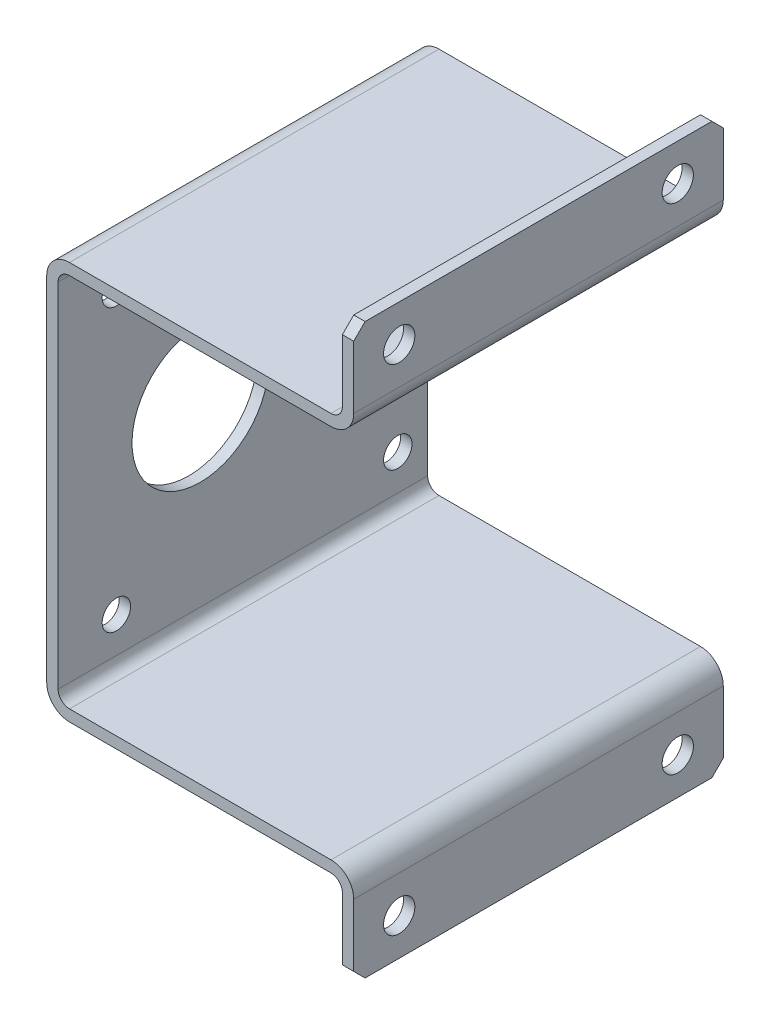
ISO-10303-21;
HEADER;
FILE_DESCRIPTION(('STEP AP214'),'2;1');
FILE_NAME('part.step','',(''),(''),'','','');
FILE_SCHEMA(('AUTOMOTIVE_DESIGN { 1 0 10303 214 1 1 1 1 }'));
ENDSEC;
DATA;
#1=APPLICATION_CONTEXT('core data for automotive mechanical design processes');
#2=APPLICATION_PROTOCOL_DEFINITION('international standard','automotive_design',2000,#1);
#3=PRODUCT_CONTEXT('',#1,'mechanical');
#4=PRODUCT('Part','Part','',(#3));
#5=PRODUCT_RELATED_PRODUCT_CATEGORY('part','',(#4));
#6=PRODUCT_DEFINITION_FORMATION('','',#4);
#7=PRODUCT_DEFINITION_CONTEXT('part definition',#1,'design');
#8=PRODUCT_DEFINITION('design','',#6,#7);
#9=PRODUCT_DEFINITION_SHAPE('','',#8);
#10=(LENGTH_UNIT() NAMED_UNIT(*) SI_UNIT(.MILLI.,.METRE.));
#11=(NAMED_UNIT(*) PLANE_ANGLE_UNIT() SI_UNIT($,.RADIAN.));
#12=(NAMED_UNIT(*) SI_UNIT($,.STERADIAN.) SOLID_ANGLE_UNIT());
#13=UNCERTAINTY_MEASURE_WITH_UNIT(LENGTH_MEASURE(1.E-05),#10,'distance_accuracy_value','');
#14=(GEOMETRIC_REPRESENTATION_CONTEXT(3) GLOBAL_UNCERTAINTY_ASSIGNED_CONTEXT((#13)) GLOBAL_UNIT_ASSIGNED_CONTEXT((#10,
#11,#12)) REPRESENTATION_CONTEXT('',''));
#15=CARTESIAN_POINT('',(0.,0.,0.));
#16=DIRECTION('',(0.,0.,1.));
#17=DIRECTION('',(1.,0.,0.));
#18=AXIS2_PLACEMENT_3D('',#15,#16,#17);
#19=CARTESIAN_POINT('',(0.,-50.,65.));
#20=DIRECTION('',(0.,1.,0.));
#21=DIRECTION('',(0.,0.,1.));
#22=AXIS2_PLACEMENT_3D('',#19,#20,#21);
#23=PLANE('',#22);
#24=DIRECTION('',(0.,0.,-1.));
#25=VECTOR('',#24,1.);
#26=CARTESIAN_POINT('',(-2.,-50.,65.));
#27=LINE('',#26,#25);
#28=CARTESIAN_POINT('',(-2.,-50.,63.));
#29=VERTEX_POINT('',#28);
#30=CARTESIAN_POINT('',(-2.,-50.,2.00000000000001));
#31=VERTEX_POINT('',#30);
#32=EDGE_CURVE('E214',#29,#31,#27,.T.);
#33=ORIENTED_EDGE('',*,*,#32,.T.);
#34=DIRECTION('',(1.,0.,0.));
#35=VECTOR('',#34,1.);
#36=CARTESIAN_POINT('',(0.,-50.,2.));
#37=LINE('',#36,#35);
#38=CARTESIAN_POINT('',(0.,-50.,2.00000000000001));
#39=VERTEX_POINT('',#38);
#40=EDGE_CURVE('E244',#31,#39,#37,.T.);
#41=ORIENTED_EDGE('',*,*,#40,.T.);
#42=DIRECTION('',(0.,0.,-1.));
#43=VECTOR('',#42,1.);
#44=CARTESIAN_POINT('',(0.,-50.,65.));
#45=LINE('',#44,#43);
#46=CARTESIAN_POINT('',(0.,-50.,63.));
#47=VERTEX_POINT('',#46);
#48=EDGE_CURVE('E220',#47,#39,#45,.T.);
#49=ORIENTED_EDGE('',*,*,#48,.F.);
#50=DIRECTION('',(-1.,0.,0.));
#51=VECTOR('',#50,1.);
#52=CARTESIAN_POINT('',(0.,-50.,63.));
#53=LINE('',#52,#51);
#54=EDGE_CURVE('E242',#47,#29,#53,.T.);
#55=ORIENTED_EDGE('',*,*,#54,.T.);
#56=EDGE_LOOP('',(#33,#41,#49,#55));
#57=FACE_BOUND('',#56,.T.);
#58=ADVANCED_FACE('F32',(#57),#23,.F.);
#59=CARTESIAN_POINT('',(0.,-33.,65.));
#60=DIRECTION('',(-1.,0.,0.));
#61=DIRECTION('',(0.,-1.,0.));
#62=AXIS2_PLACEMENT_3D('',#59,#60,#61);
#63=PLANE('',#62);
#64=CARTESIAN_POINT('',(0.,-43.5,57.));
#65=DIRECTION('',(-1.,0.,0.));
#66=DIRECTION('',(0.,0.,1.));
#67=AXIS2_PLACEMENT_3D('',#64,#65,#66);
#68=CIRCLE('',#67,2.75);
#69=CARTESIAN_POINT('',(0.,-43.5,59.75));
#70=VERTEX_POINT('',#69);
#71=EDGE_CURVE('E505',#70,#70,#68,.T.);
#72=ORIENTED_EDGE('',*,*,#71,.T.);
#73=EDGE_LOOP('',(#72));
#74=FACE_BOUND('',#73,.T.);
#75=CARTESIAN_POINT('',(0.,-43.5,8.));
#76=DIRECTION('',(-1.,0.,0.));
#77=DIRECTION('',(0.,0.,1.));
#78=AXIS2_PLACEMENT_3D('',#75,#76,#77);
#79=CIRCLE('',#78,2.75);
#80=CARTESIAN_POINT('',(0.,-43.5,10.75));
#81=VERTEX_POINT('',#80);
#82=EDGE_CURVE('E499',#81,#81,#79,.T.);
#83=ORIENTED_EDGE('',*,*,#82,.T.);
#84=EDGE_LOOP('',(#83));
#85=FACE_BOUND('',#84,.T.);
#86=DIRECTION('',(0.,1.,0.));
#87=VECTOR('',#86,1.);
#88=CARTESIAN_POINT('',(0.,-33.,0.));
#89=LINE('',#88,#87);
#90=CARTESIAN_POINT('',(0.,-48.,0.));
#91=VERTEX_POINT('',#90);
#92=CARTESIAN_POINT('',(0.,-37.,0.));
#93=VERTEX_POINT('',#92);
#94=EDGE_CURVE('E364',#91,#93,#89,.T.);
#95=ORIENTED_EDGE('',*,*,#94,.T.);
#96=DIRECTION('',(0.,0.,-1.));
#97=VECTOR('',#96,1.);
#98=CARTESIAN_POINT('',(0.,-37.,65.));
#99=LINE('',#98,#97);
#100=CARTESIAN_POINT('',(0.,-37.,65.));
#101=VERTEX_POINT('',#100);
#102=EDGE_CURVE('E294',#93,#101,#99,.F.);
#103=ORIENTED_EDGE('',*,*,#102,.T.);
#104=DIRECTION('',(0.,1.,0.));
#105=VECTOR('',#104,1.);
#106=CARTESIAN_POINT('',(0.,-33.,65.));
#107=LINE('',#106,#105);
#108=CARTESIAN_POINT('',(0.,-48.,65.));
#109=VERTEX_POINT('',#108);
#110=EDGE_CURVE('E385',#109,#101,#107,.T.);
#111=ORIENTED_EDGE('',*,*,#110,.F.);
#112=DIRECTION('',(0.,0.707106781186545,0.70710678118655));
#113=VECTOR('',#112,1.);
#114=CARTESIAN_POINT('',(0.,-48.,65.));
#115=LINE('',#114,#113);
#116=EDGE_CURVE('E247',#109,#47,#115,.F.);
#117=ORIENTED_EDGE('',*,*,#116,.T.);
#118=ORIENTED_EDGE('',*,*,#48,.T.);
#119=DIRECTION('',(0.,0.70710678118655,-0.707106781186545));
#120=VECTOR('',#119,1.);
#121=CARTESIAN_POINT('',(0.,-50.,2.));
#122=LINE('',#121,#120);
#123=EDGE_CURVE('E249',#39,#91,#122,.T.);
#124=ORIENTED_EDGE('',*,*,#123,.T.);
#125=EDGE_LOOP('',(#95,#103,#111,#117,#118,#124));
#126=FACE_BOUND('',#125,.T.);
#127=ADVANCED_FACE('F422',(#74,#85,#126),#63,.F.);
#128=CARTESIAN_POINT('',(-52.,-33.,65.));
#129=DIRECTION('',(0.,-1.,0.));
#130=DIRECTION('',(0.,0.,-1.));
#131=AXIS2_PLACEMENT_3D('',#128,#129,#130);
#132=PLANE('',#131);
#133=DIRECTION('',(-1.,0.,0.));
#134=VECTOR('',#133,1.);
#135=CARTESIAN_POINT('',(-52.,-33.,0.));
#136=LINE('',#135,#134);
#137=CARTESIAN_POINT('',(-4.,-33.,0.));
#138=VERTEX_POINT('',#137);
#139=CARTESIAN_POINT('',(-50.,-33.,0.));
#140=VERTEX_POINT('',#139);
#141=EDGE_CURVE('E338',#138,#140,#136,.T.);
#142=ORIENTED_EDGE('',*,*,#141,.T.);
#143=DIRECTION('',(0.,0.,-1.));
#144=VECTOR('',#143,1.);
#145=CARTESIAN_POINT('',(-50.,-33.,65.));
#146=LINE('',#145,#144);
#147=CARTESIAN_POINT('',(-50.,-33.,65.));
#148=VERTEX_POINT('',#147);
#149=EDGE_CURVE('E311',#140,#148,#146,.F.);
#150=ORIENTED_EDGE('',*,*,#149,.T.);
#151=DIRECTION('',(-1.,0.,0.));
#152=VECTOR('',#151,1.);
#153=CARTESIAN_POINT('',(-52.,-33.,65.));
#154=LINE('',#153,#152);
#155=CARTESIAN_POINT('',(-4.,-33.,65.));
#156=VERTEX_POINT('',#155);
#157=EDGE_CURVE('E349',#156,#148,#154,.T.);
#158=ORIENTED_EDGE('',*,*,#157,.F.);
#159=DIRECTION('',(0.,0.,-1.));
#160=VECTOR('',#159,1.);
#161=CARTESIAN_POINT('',(-4.,-33.,65.));
#162=LINE('',#161,#160);
#163=EDGE_CURVE('E291',#156,#138,#162,.T.);
#164=ORIENTED_EDGE('',*,*,#163,.T.);
#165=EDGE_LOOP('',(#142,#150,#158,#164));
#166=FACE_BOUND('',#165,.T.);
#167=ADVANCED_FACE('F428',(#166),#132,.F.);
#168=CARTESIAN_POINT('',(-52.,33.,65.));
#169=DIRECTION('',(-1.,0.,0.));
#170=DIRECTION('',(0.,-1.,0.));
#171=AXIS2_PLACEMENT_3D('',#168,#169,#170);
#172=PLANE('',#171);
#173=CARTESIAN_POINT('',(-52.,24.7487373415291,54.7487373415292));
#174=DIRECTION('',(-1.,0.,0.));
#175=DIRECTION('',(0.,-1.,0.));
#176=AXIS2_PLACEMENT_3D('',#173,#174,#175);
#177=CIRCLE('',#176,2.49999999999999);
#178=CARTESIAN_POINT('',(-52.,22.2487373415291,54.7487373415292));
#179=VERTEX_POINT('',#178);
#180=EDGE_CURVE('E529',#179,#179,#177,.T.);
#181=ORIENTED_EDGE('',*,*,#180,.T.);
#182=EDGE_LOOP('',(#181));
#183=FACE_BOUND('',#182,.T.);
#184=CARTESIAN_POINT('',(-52.,-24.7487373415291,54.7487373415292));
#185=DIRECTION('',(-1.,0.,0.));
#186=DIRECTION('',(0.,-1.,0.));
#187=AXIS2_PLACEMENT_3D('',#184,#185,#186);
#188=CIRCLE('',#187,2.49999999999999);
#189=CARTESIAN_POINT('',(-52.,-27.2487373415291,54.7487373415292));
#190=VERTEX_POINT('',#189);
#191=EDGE_CURVE('E523',#190,#190,#188,.T.);
#192=ORIENTED_EDGE('',*,*,#191,.T.);
#193=EDGE_LOOP('',(#192));
#194=FACE_BOUND('',#193,.T.);
#195=CARTESIAN_POINT('',(-52.,-24.7487373415291,5.25126265847079));
#196=DIRECTION('',(-1.,0.,0.));
#197=DIRECTION('',(0.,-1.,0.));
#198=AXIS2_PLACEMENT_3D('',#195,#196,#197);
#199=CIRCLE('',#198,2.49999999999999);
#200=CARTESIAN_POINT('',(-52.,-27.2487373415291,5.25126265847079));
#201=VERTEX_POINT('',#200);
#202=EDGE_CURVE('E517',#201,#201,#199,.T.);
#203=ORIENTED_EDGE('',*,*,#202,.T.);
#204=EDGE_LOOP('',(#203));
#205=FACE_BOUND('',#204,.T.);
#206=CARTESIAN_POINT('',(-52.,24.7487373415291,5.25126265847079));
#207=DIRECTION('',(-1.,0.,0.));
#208=DIRECTION('',(0.,-1.,0.));
#209=AXIS2_PLACEMENT_3D('',#206,#207,#208);
#210=CIRCLE('',#209,2.49999999999999);
#211=CARTESIAN_POINT('',(-52.,22.2487373415291,5.25126265847079));
#212=VERTEX_POINT('',#211);
#213=EDGE_CURVE('E511',#212,#212,#210,.T.);
#214=ORIENTED_EDGE('',*,*,#213,.T.);
#215=EDGE_LOOP('',(#214));
#216=FACE_BOUND('',#215,.T.);
#217=CARTESIAN_POINT('',(-52.,0.,40.));
#218=DIRECTION('',(-1.,0.,0.));
#219=DIRECTION('',(0.,-1.,0.));
#220=AXIS2_PLACEMENT_3D('',#217,#218,#219);
#221=CIRCLE('',#220,12.);
#222=CARTESIAN_POINT('',(-52.,-12.,40.));
#223=VERTEX_POINT('',#222);
#224=EDGE_CURVE('E367',#223,#223,#221,.T.);
#225=ORIENTED_EDGE('',*,*,#224,.T.);
#226=EDGE_LOOP('',(#225));
#227=FACE_BOUND('',#226,.T.);
#228=DIRECTION('',(0.,1.,0.));
#229=VECTOR('',#228,1.);
#230=CARTESIAN_POINT('',(-52.,33.,65.));
#231=LINE('',#230,#229);
#232=CARTESIAN_POINT('',(-52.,-31.,65.));
#233=VERTEX_POINT('',#232);
#234=CARTESIAN_POINT('',(-52.,31.,65.));
#235=VERTEX_POINT('',#234);
#236=EDGE_CURVE('E346',#233,#235,#231,.T.);
#237=ORIENTED_EDGE('',*,*,#236,.F.);
#238=DIRECTION('',(0.,0.,-1.));
#239=VECTOR('',#238,1.);
#240=CARTESIAN_POINT('',(-52.,-31.,0.));
#241=LINE('',#240,#239);
#242=CARTESIAN_POINT('',(-52.,-31.,0.));
#243=VERTEX_POINT('',#242);
#244=EDGE_CURVE('E308',#233,#243,#241,.T.);
#245=ORIENTED_EDGE('',*,*,#244,.T.);
#246=DIRECTION('',(0.,1.,0.));
#247=VECTOR('',#246,1.);
#248=CARTESIAN_POINT('',(-52.,33.,0.));
#249=LINE('',#248,#247);
#250=CARTESIAN_POINT('',(-52.,31.,0.));
#251=VERTEX_POINT('',#250);
#252=EDGE_CURVE('E332',#243,#251,#249,.T.);
#253=ORIENTED_EDGE('',*,*,#252,.T.);
#254=DIRECTION('',(0.,0.,-1.));
#255=VECTOR('',#254,1.);
#256=CARTESIAN_POINT('',(-52.,31.,65.));
#257=LINE('',#256,#255);
#258=EDGE_CURVE('E306',#251,#235,#257,.F.);
#259=ORIENTED_EDGE('',*,*,#258,.T.);
#260=EDGE_LOOP('',(#237,#245,#253,#259));
#261=FACE_BOUND('',#260,.T.);
#262=ADVANCED_FACE('F336',(#183,#194,#205,#216,#227,#261),#172,.F.);
#263=CARTESIAN_POINT('',(0.,33.,65.));
#264=DIRECTION('',(0.,1.,0.));
#265=DIRECTION('',(-1.,0.,0.));
#266=AXIS2_PLACEMENT_3D('',#263,#264,#265);
#267=PLANE('',#266);
#268=DIRECTION('',(1.,0.,0.));
#269=VECTOR('',#268,1.);
#270=CARTESIAN_POINT('',(0.,33.,65.));
#271=LINE('',#270,#269);
#272=CARTESIAN_POINT('',(-50.,33.,65.));
#273=VERTEX_POINT('',#272);
#274=CARTESIAN_POINT('',(-4.00000000000001,33.,65.));
#275=VERTEX_POINT('',#274);
#276=EDGE_CURVE('E342',#273,#275,#271,.T.);
#277=ORIENTED_EDGE('',*,*,#276,.F.);
#278=DIRECTION('',(0.,0.,-1.));
#279=VECTOR('',#278,1.);
#280=CARTESIAN_POINT('',(-50.,33.,0.));
#281=LINE('',#280,#279);
#282=CARTESIAN_POINT('',(-50.,33.,0.));
#283=VERTEX_POINT('',#282);
#284=EDGE_CURVE('E313',#273,#283,#281,.T.);
#285=ORIENTED_EDGE('',*,*,#284,.T.);
#286=DIRECTION('',(1.,0.,0.));
#287=VECTOR('',#286,1.);
#288=CARTESIAN_POINT('',(0.,33.,0.));
#289=LINE('',#288,#287);
#290=CARTESIAN_POINT('',(-4.00000000000001,33.,0.));
#291=VERTEX_POINT('',#290);
#292=EDGE_CURVE('E333',#283,#291,#289,.T.);
#293=ORIENTED_EDGE('',*,*,#292,.T.);
#294=DIRECTION('',(0.,0.,-1.));
#295=VECTOR('',#294,1.);
#296=CARTESIAN_POINT('',(-4.00000000000001,33.,65.));
#297=LINE('',#296,#295);
#298=EDGE_CURVE('E288',#291,#275,#297,.F.);
#299=ORIENTED_EDGE('',*,*,#298,.T.);
#300=EDGE_LOOP('',(#277,#285,#293,#299));
#301=FACE_BOUND('',#300,.T.);
#302=ADVANCED_FACE('F341',(#301),#267,.F.);
#303=CARTESIAN_POINT('',(0.,50.,65.));
#304=DIRECTION('',(-1.,0.,0.));
#305=DIRECTION('',(0.,-1.,0.));
#306=AXIS2_PLACEMENT_3D('',#303,#304,#305);
#307=PLANE('',#306);
#308=CARTESIAN_POINT('',(0.,43.5,57.));
#309=DIRECTION('',(-1.,0.,0.));
#310=DIRECTION('',(0.,0.,1.));
#311=AXIS2_PLACEMENT_3D('',#308,#309,#310);
#312=CIRCLE('',#311,2.75);
#313=CARTESIAN_POINT('',(0.,43.5,59.75));
#314=VERTEX_POINT('',#313);
#315=EDGE_CURVE('E494',#314,#314,#312,.T.);
#316=ORIENTED_EDGE('',*,*,#315,.T.);
#317=EDGE_LOOP('',(#316));
#318=FACE_BOUND('',#317,.T.);
#319=CARTESIAN_POINT('',(0.,43.5,8.));
#320=DIRECTION('',(-1.,0.,0.));
#321=DIRECTION('',(0.,0.,1.));
#322=AXIS2_PLACEMENT_3D('',#319,#320,#321);
#323=CIRCLE('',#322,2.75);
#324=CARTESIAN_POINT('',(0.,43.5,10.75));
#325=VERTEX_POINT('',#324);
#326=EDGE_CURVE('E488',#325,#325,#323,.T.);
#327=ORIENTED_EDGE('',*,*,#326,.T.);
#328=EDGE_LOOP('',(#327));
#329=FACE_BOUND('',#328,.T.);
#330=DIRECTION('',(0.,1.,0.));
#331=VECTOR('',#330,1.);
#332=CARTESIAN_POINT('',(0.,50.,65.));
#333=LINE('',#332,#331);
#334=CARTESIAN_POINT('',(0.,37.,65.));
#335=VERTEX_POINT('',#334);
#336=CARTESIAN_POINT('',(0.,48.,65.));
#337=VERTEX_POINT('',#336);
#338=EDGE_CURVE('E345',#335,#337,#333,.T.);
#339=ORIENTED_EDGE('',*,*,#338,.F.);
#340=DIRECTION('',(0.,0.,-1.));
#341=VECTOR('',#340,1.);
#342=CARTESIAN_POINT('',(0.,37.,65.));
#343=LINE('',#342,#341);
#344=CARTESIAN_POINT('',(0.,37.,0.));
#345=VERTEX_POINT('',#344);
#346=EDGE_CURVE('E285',#335,#345,#343,.T.);
#347=ORIENTED_EDGE('',*,*,#346,.T.);
#348=DIRECTION('',(0.,1.,0.));
#349=VECTOR('',#348,1.);
#350=CARTESIAN_POINT('',(0.,50.,0.));
#351=LINE('',#350,#349);
#352=CARTESIAN_POINT('',(0.,48.,0.));
#353=VERTEX_POINT('',#352);
#354=EDGE_CURVE('E371',#345,#353,#351,.T.);
#355=ORIENTED_EDGE('',*,*,#354,.T.);
#356=DIRECTION('',(0.,0.70710678118655,0.707106781186545));
#357=VECTOR('',#356,1.);
#358=CARTESIAN_POINT('',(0.,50.,2.));
#359=LINE('',#358,#357);
#360=CARTESIAN_POINT('',(0.,50.,2.00000000000001));
#361=VERTEX_POINT('',#360);
#362=EDGE_CURVE('E235',#353,#361,#359,.T.);
#363=ORIENTED_EDGE('',*,*,#362,.T.);
#364=DIRECTION('',(0.,0.,-1.));
#365=VECTOR('',#364,1.);
#366=CARTESIAN_POINT('',(0.,50.,65.));
#367=LINE('',#366,#365);
#368=CARTESIAN_POINT('',(0.,50.,63.));
#369=VERTEX_POINT('',#368);
#370=EDGE_CURVE('E213',#369,#361,#367,.T.);
#371=ORIENTED_EDGE('',*,*,#370,.F.);
#372=DIRECTION('',(0.,0.707106781186545,-0.70710678118655));
#373=VECTOR('',#372,1.);
#374=CARTESIAN_POINT('',(0.,48.,65.));
#375=LINE('',#374,#373);
#376=EDGE_CURVE('E219',#369,#337,#375,.F.);
#377=ORIENTED_EDGE('',*,*,#376,.T.);
#378=EDGE_LOOP('',(#339,#347,#355,#363,#371,#377));
#379=FACE_BOUND('',#378,.T.);
#380=ADVANCED_FACE('F409',(#318,#329,#379),#307,.F.);
#381=CARTESIAN_POINT('',(-2.00000000000001,50.,65.));
#382=DIRECTION('',(0.,-1.,0.));
#383=DIRECTION('',(0.,0.,-1.));
#384=AXIS2_PLACEMENT_3D('',#381,#382,#383);
#385=PLANE('',#384);
#386=ORIENTED_EDGE('',*,*,#370,.T.);
#387=DIRECTION('',(-1.,0.,0.));
#388=VECTOR('',#387,1.);
#389=CARTESIAN_POINT('',(-2.00000000000001,50.,2.));
#390=LINE('',#389,#388);
#391=CARTESIAN_POINT('',(-2.00000000000001,50.,2.00000000000001));
#392=VERTEX_POINT('',#391);
#393=EDGE_CURVE('E204',#361,#392,#390,.T.);
#394=ORIENTED_EDGE('',*,*,#393,.T.);
#395=DIRECTION('',(0.,0.,-1.));
#396=VECTOR('',#395,1.);
#397=CARTESIAN_POINT('',(-2.00000000000001,50.,65.));
#398=LINE('',#397,#396);
#399=CARTESIAN_POINT('',(-2.00000000000001,50.,63.));
#400=VERTEX_POINT('',#399);
#401=EDGE_CURVE('E196',#400,#392,#398,.T.);
#402=ORIENTED_EDGE('',*,*,#401,.F.);
#403=DIRECTION('',(1.,0.,0.));
#404=VECTOR('',#403,1.);
#405=CARTESIAN_POINT('',(-2.00000000000001,50.,63.));
#406=LINE('',#405,#404);
#407=EDGE_CURVE('E210',#400,#369,#406,.T.);
#408=ORIENTED_EDGE('',*,*,#407,.T.);
#409=EDGE_LOOP('',(#386,#394,#402,#408));
#410=FACE_BOUND('',#409,.T.);
#411=ADVANCED_FACE('F209',(#410),#385,.F.);
#412=CARTESIAN_POINT('',(-2.,35.,65.));
#413=DIRECTION('',(1.,0.,0.));
#414=DIRECTION('',(0.,1.,0.));
#415=AXIS2_PLACEMENT_3D('',#412,#413,#414);
#416=PLANE('',#415);
#417=CARTESIAN_POINT('',(-1.99999999999998,43.5,57.));
#418=DIRECTION('',(-1.,0.,0.));
#419=DIRECTION('',(0.,0.,1.));
#420=AXIS2_PLACEMENT_3D('',#417,#418,#419);
#421=CIRCLE('',#420,2.74999999999999);
#422=CARTESIAN_POINT('',(-1.99999999999998,43.5,59.75));
#423=VERTEX_POINT('',#422);
#424=EDGE_CURVE('E496',#423,#423,#421,.T.);
#425=ORIENTED_EDGE('',*,*,#424,.F.);
#426=EDGE_LOOP('',(#425));
#427=FACE_BOUND('',#426,.T.);
#428=CARTESIAN_POINT('',(-1.99999999999998,43.5,8.));
#429=DIRECTION('',(-1.,0.,0.));
#430=DIRECTION('',(0.,0.,1.));
#431=AXIS2_PLACEMENT_3D('',#428,#429,#430);
#432=CIRCLE('',#431,2.74999999999999);
#433=CARTESIAN_POINT('',(-1.99999999999998,43.5,10.75));
#434=VERTEX_POINT('',#433);
#435=EDGE_CURVE('E491',#434,#434,#432,.T.);
#436=ORIENTED_EDGE('',*,*,#435,.F.);
#437=EDGE_LOOP('',(#436));
#438=FACE_BOUND('',#437,.T.);
#439=DIRECTION('',(0.,-1.,0.));
#440=VECTOR('',#439,1.);
#441=CARTESIAN_POINT('',(-2.,35.,0.));
#442=LINE('',#441,#440);
#443=CARTESIAN_POINT('',(-2.00000000000001,48.,0.));
#444=VERTEX_POINT('',#443);
#445=CARTESIAN_POINT('',(-2.,37.,0.));
#446=VERTEX_POINT('',#445);
#447=EDGE_CURVE('E373',#444,#446,#442,.T.);
#448=ORIENTED_EDGE('',*,*,#447,.T.);
#449=DIRECTION('',(0.,0.,-1.));
#450=VECTOR('',#449,1.);
#451=CARTESIAN_POINT('',(-2.,37.,65.));
#452=LINE('',#451,#450);
#453=CARTESIAN_POINT('',(-2.,37.,65.));
#454=VERTEX_POINT('',#453);
#455=EDGE_CURVE('E299',#446,#454,#452,.F.);
#456=ORIENTED_EDGE('',*,*,#455,.T.);
#457=DIRECTION('',(0.,-1.,0.));
#458=VECTOR('',#457,1.);
#459=CARTESIAN_POINT('',(-2.,35.,65.));
#460=LINE('',#459,#458);
#461=CARTESIAN_POINT('',(-2.00000000000001,48.,65.));
#462=VERTEX_POINT('',#461);
#463=EDGE_CURVE('E198',#462,#454,#460,.T.);
#464=ORIENTED_EDGE('',*,*,#463,.F.);
#465=DIRECTION('',(0.,-0.707106781186545,0.70710678118655));
#466=VECTOR('',#465,1.);
#467=CARTESIAN_POINT('',(-2.00000000000001,48.,65.));
#468=LINE('',#467,#466);
#469=EDGE_CURVE('E192',#462,#400,#468,.F.);
#470=ORIENTED_EDGE('',*,*,#469,.T.);
#471=ORIENTED_EDGE('',*,*,#401,.T.);
#472=DIRECTION('',(0.,-0.70710678118655,-0.707106781186545));
#473=VECTOR('',#472,1.);
#474=CARTESIAN_POINT('',(-2.00000000000001,50.,2.));
#475=LINE('',#474,#473);
#476=EDGE_CURVE('E203',#392,#444,#475,.T.);
#477=ORIENTED_EDGE('',*,*,#476,.T.);
#478=EDGE_LOOP('',(#448,#456,#464,#470,#471,#477));
#479=FACE_BOUND('',#478,.T.);
#480=ADVANCED_FACE('F195',(#427,#438,#479),#416,.F.);
#481=CARTESIAN_POINT('',(-54.,35.,65.));
#482=DIRECTION('',(0.,-1.,0.));
#483=DIRECTION('',(1.,0.,0.));
#484=AXIS2_PLACEMENT_3D('',#481,#482,#483);
#485=PLANE('',#484);
#486=DIRECTION('',(-1.,0.,0.));
#487=VECTOR('',#486,1.);
#488=CARTESIAN_POINT('',(-54.,35.,65.));
#489=LINE('',#488,#487);
#490=CARTESIAN_POINT('',(-4.,35.,65.));
#491=VERTEX_POINT('',#490);
#492=CARTESIAN_POINT('',(-50.,35.,65.));
#493=VERTEX_POINT('',#492);
#494=EDGE_CURVE('E354',#491,#493,#489,.T.);
#495=ORIENTED_EDGE('',*,*,#494,.F.);
#496=DIRECTION('',(0.,0.,-1.));
#497=VECTOR('',#496,1.);
#498=CARTESIAN_POINT('',(-4.,35.,0.));
#499=LINE('',#498,#497);
#500=CARTESIAN_POINT('',(-4.,35.,0.));
#501=VERTEX_POINT('',#500);
#502=EDGE_CURVE('E296',#491,#501,#499,.T.);
#503=ORIENTED_EDGE('',*,*,#502,.T.);
#504=DIRECTION('',(-1.,0.,0.));
#505=VECTOR('',#504,1.);
#506=CARTESIAN_POINT('',(-54.,35.,0.));
#507=LINE('',#506,#505);
#508=CARTESIAN_POINT('',(-50.,35.,0.));
#509=VERTEX_POINT('',#508);
#510=EDGE_CURVE('E375',#501,#509,#507,.T.);
#511=ORIENTED_EDGE('',*,*,#510,.T.);
#512=DIRECTION('',(0.,0.,-1.));
#513=VECTOR('',#512,1.);
#514=CARTESIAN_POINT('',(-50.,35.,65.));
#515=LINE('',#514,#513);
#516=EDGE_CURVE('E271',#509,#493,#515,.F.);
#517=ORIENTED_EDGE('',*,*,#516,.T.);
#518=EDGE_LOOP('',(#495,#503,#511,#517));
#519=FACE_BOUND('',#518,.T.);
#520=ADVANCED_FACE('F402',(#519),#485,.F.);
#521=CARTESIAN_POINT('',(-54.,-35.,65.));
#522=DIRECTION('',(1.,0.,0.));
#523=DIRECTION('',(0.,1.,0.));
#524=AXIS2_PLACEMENT_3D('',#521,#522,#523);
#525=PLANE('',#524);
#526=CARTESIAN_POINT('',(-54.,24.7487373415291,54.7487373415292));
#527=DIRECTION('',(-1.,0.,0.));
#528=DIRECTION('',(0.,0.,1.));
#529=AXIS2_PLACEMENT_3D('',#526,#527,#528);
#530=CIRCLE('',#529,2.49999999999999);
#531=CARTESIAN_POINT('',(-54.,24.7487373415291,57.2487373415292));
#532=VERTEX_POINT('',#531);
#533=EDGE_CURVE('E532',#532,#532,#530,.T.);
#534=ORIENTED_EDGE('',*,*,#533,.F.);
#535=EDGE_LOOP('',(#534));
#536=FACE_BOUND('',#535,.T.);
#537=CARTESIAN_POINT('',(-54.,-24.7487373415291,54.7487373415292));
#538=DIRECTION('',(-1.,0.,0.));
#539=DIRECTION('',(0.,0.,1.));
#540=AXIS2_PLACEMENT_3D('',#537,#538,#539);
#541=CIRCLE('',#540,2.49999999999999);
#542=CARTESIAN_POINT('',(-54.,-24.7487373415291,57.2487373415292));
#543=VERTEX_POINT('',#542);
#544=EDGE_CURVE('E526',#543,#543,#541,.T.);
#545=ORIENTED_EDGE('',*,*,#544,.F.);
#546=EDGE_LOOP('',(#545));
#547=FACE_BOUND('',#546,.T.);
#548=CARTESIAN_POINT('',(-54.,-24.7487373415291,5.25126265847079));
#549=DIRECTION('',(-1.,0.,0.));
#550=DIRECTION('',(0.,0.,1.));
#551=AXIS2_PLACEMENT_3D('',#548,#549,#550);
#552=CIRCLE('',#551,2.49999999999999);
#553=CARTESIAN_POINT('',(-54.,-24.7487373415291,7.75126265847078));
#554=VERTEX_POINT('',#553);
#555=EDGE_CURVE('E520',#554,#554,#552,.T.);
#556=ORIENTED_EDGE('',*,*,#555,.F.);
#557=EDGE_LOOP('',(#556));
#558=FACE_BOUND('',#557,.T.);
#559=CARTESIAN_POINT('',(-54.,24.7487373415291,5.25126265847079));
#560=DIRECTION('',(-1.,0.,0.));
#561=DIRECTION('',(0.,0.,1.));
#562=AXIS2_PLACEMENT_3D('',#559,#560,#561);
#563=CIRCLE('',#562,2.49999999999999);
#564=CARTESIAN_POINT('',(-54.,24.7487373415291,7.75126265847078));
#565=VERTEX_POINT('',#564);
#566=EDGE_CURVE('E514',#565,#565,#563,.T.);
#567=ORIENTED_EDGE('',*,*,#566,.F.);
#568=EDGE_LOOP('',(#567));
#569=FACE_BOUND('',#568,.T.);
#570=CARTESIAN_POINT('',(-54.,0.,40.));
#571=DIRECTION('',(-1.,0.,0.));
#572=DIRECTION('',(0.,-1.,0.));
#573=AXIS2_PLACEMENT_3D('',#570,#571,#572);
#574=CIRCLE('',#573,12.);
#575=CARTESIAN_POINT('',(-54.,-12.,40.));
#576=VERTEX_POINT('',#575);
#577=EDGE_CURVE('E485',#576,#576,#574,.T.);
#578=ORIENTED_EDGE('',*,*,#577,.F.);
#579=EDGE_LOOP('',(#578));
#580=FACE_BOUND('',#579,.T.);
#581=DIRECTION('',(0.,-1.,0.));
#582=VECTOR('',#581,1.);
#583=CARTESIAN_POINT('',(-54.,-35.,65.));
#584=LINE('',#583,#582);
#585=CARTESIAN_POINT('',(-54.,31.,65.));
#586=VERTEX_POINT('',#585);
#587=CARTESIAN_POINT('',(-54.,-31.,65.));
#588=VERTEX_POINT('',#587);
#589=EDGE_CURVE('E356',#586,#588,#584,.T.);
#590=ORIENTED_EDGE('',*,*,#589,.F.);
#591=DIRECTION('',(0.,0.,-1.));
#592=VECTOR('',#591,1.);
#593=CARTESIAN_POINT('',(-54.,31.,65.));
#594=LINE('',#593,#592);
#595=CARTESIAN_POINT('',(-54.,31.,0.));
#596=VERTEX_POINT('',#595);
#597=EDGE_CURVE('E258',#586,#596,#594,.T.);
#598=ORIENTED_EDGE('',*,*,#597,.T.);
#599=DIRECTION('',(0.,-1.,0.));
#600=VECTOR('',#599,1.);
#601=CARTESIAN_POINT('',(-54.,-35.,0.));
#602=LINE('',#601,#600);
#603=CARTESIAN_POINT('',(-54.,-31.,0.));
#604=VERTEX_POINT('',#603);
#605=EDGE_CURVE('E377',#596,#604,#602,.T.);
#606=ORIENTED_EDGE('',*,*,#605,.T.);
#607=DIRECTION('',(0.,0.,-1.));
#608=VECTOR('',#607,1.);
#609=CARTESIAN_POINT('',(-54.,-31.,65.));
#610=LINE('',#609,#608);
#611=EDGE_CURVE('E256',#604,#588,#610,.F.);
#612=ORIENTED_EDGE('',*,*,#611,.T.);
#613=EDGE_LOOP('',(#590,#598,#606,#612));
#614=FACE_BOUND('',#613,.T.);
#615=ADVANCED_FACE('F538',(#536,#547,#558,#569,#580,#614),#525,.F.);
#616=CARTESIAN_POINT('',(-1.99999999999999,-35.,65.));
#617=DIRECTION('',(0.,1.,0.));
#618=DIRECTION('',(-1.,0.,0.));
#619=AXIS2_PLACEMENT_3D('',#616,#617,#618);
#620=PLANE('',#619);
#621=DIRECTION('',(1.,0.,0.));
#622=VECTOR('',#621,1.);
#623=CARTESIAN_POINT('',(-1.99999999999999,-35.,0.));
#624=LINE('',#623,#622);
#625=CARTESIAN_POINT('',(-50.,-35.,0.));
#626=VERTEX_POINT('',#625);
#627=CARTESIAN_POINT('',(-3.99999999999999,-35.,0.));
#628=VERTEX_POINT('',#627);
#629=EDGE_CURVE('E380',#626,#628,#624,.T.);
#630=ORIENTED_EDGE('',*,*,#629,.T.);
#631=DIRECTION('',(0.,0.,-1.));
#632=VECTOR('',#631,1.);
#633=CARTESIAN_POINT('',(-3.99999999999999,-35.,65.));
#634=LINE('',#633,#632);
#635=CARTESIAN_POINT('',(-3.99999999999999,-35.,65.));
#636=VERTEX_POINT('',#635);
#637=EDGE_CURVE('E304',#628,#636,#634,.F.);
#638=ORIENTED_EDGE('',*,*,#637,.T.);
#639=DIRECTION('',(1.,0.,0.));
#640=VECTOR('',#639,1.);
#641=CARTESIAN_POINT('',(-1.99999999999999,-35.,65.));
#642=LINE('',#641,#640);
#643=CARTESIAN_POINT('',(-50.,-35.,65.));
#644=VERTEX_POINT('',#643);
#645=EDGE_CURVE('E359',#644,#636,#642,.T.);
#646=ORIENTED_EDGE('',*,*,#645,.F.);
#647=DIRECTION('',(0.,0.,-1.));
#648=VECTOR('',#647,1.);
#649=CARTESIAN_POINT('',(-50.,-35.,65.));
#650=LINE('',#649,#648);
#651=EDGE_CURVE('E282',#644,#626,#650,.T.);
#652=ORIENTED_EDGE('',*,*,#651,.T.);
#653=EDGE_LOOP('',(#630,#638,#646,#652));
#654=FACE_BOUND('',#653,.T.);
#655=ADVANCED_FACE('F541',(#654),#620,.F.);
#656=CARTESIAN_POINT('',(-2.,-50.,65.));
#657=DIRECTION('',(1.,0.,0.));
#658=DIRECTION('',(0.,1.,0.));
#659=AXIS2_PLACEMENT_3D('',#656,#657,#658);
#660=PLANE('',#659);
#661=CARTESIAN_POINT('',(-2.,-43.5,57.));
#662=DIRECTION('',(-1.,0.,0.));
#663=DIRECTION('',(0.,0.,1.));
#664=AXIS2_PLACEMENT_3D('',#661,#662,#663);
#665=CIRCLE('',#664,2.74999999999999);
#666=CARTESIAN_POINT('',(-2.,-43.5,59.75));
#667=VERTEX_POINT('',#666);
#668=EDGE_CURVE('E508',#667,#667,#665,.T.);
#669=ORIENTED_EDGE('',*,*,#668,.F.);
#670=EDGE_LOOP('',(#669));
#671=FACE_BOUND('',#670,.T.);
#672=CARTESIAN_POINT('',(-2.,-43.5,8.));
#673=DIRECTION('',(-1.,0.,0.));
#674=DIRECTION('',(0.,0.,1.));
#675=AXIS2_PLACEMENT_3D('',#672,#673,#674);
#676=CIRCLE('',#675,2.74999999999999);
#677=CARTESIAN_POINT('',(-2.,-43.5,10.75));
#678=VERTEX_POINT('',#677);
#679=EDGE_CURVE('E502',#678,#678,#676,.T.);
#680=ORIENTED_EDGE('',*,*,#679,.F.);
#681=EDGE_LOOP('',(#680));
#682=FACE_BOUND('',#681,.T.);
#683=DIRECTION('',(0.,-1.,0.));
#684=VECTOR('',#683,1.);
#685=CARTESIAN_POINT('',(-2.,-50.,65.));
#686=LINE('',#685,#684);
#687=CARTESIAN_POINT('',(-2.,-37.,65.));
#688=VERTEX_POINT('',#687);
#689=CARTESIAN_POINT('',(-2.,-48.,65.));
#690=VERTEX_POINT('',#689);
#691=EDGE_CURVE('E362',#688,#690,#686,.T.);
#692=ORIENTED_EDGE('',*,*,#691,.F.);
#693=DIRECTION('',(0.,0.,-1.));
#694=VECTOR('',#693,1.);
#695=CARTESIAN_POINT('',(-2.,-37.,0.));
#696=LINE('',#695,#694);
#697=CARTESIAN_POINT('',(-2.,-37.,0.));
#698=VERTEX_POINT('',#697);
#699=EDGE_CURVE('E301',#688,#698,#696,.T.);
#700=ORIENTED_EDGE('',*,*,#699,.T.);
#701=DIRECTION('',(0.,-1.,0.));
#702=VECTOR('',#701,1.);
#703=CARTESIAN_POINT('',(-2.,-50.,0.));
#704=LINE('',#703,#702);
#705=CARTESIAN_POINT('',(-2.,-48.,0.));
#706=VERTEX_POINT('',#705);
#707=EDGE_CURVE('E383',#698,#706,#704,.T.);
#708=ORIENTED_EDGE('',*,*,#707,.T.);
#709=DIRECTION('',(0.,-0.70710678118655,0.707106781186545));
#710=VECTOR('',#709,1.);
#711=CARTESIAN_POINT('',(-2.,-50.,2.));
#712=LINE('',#711,#710);
#713=EDGE_CURVE('E254',#706,#31,#712,.T.);
#714=ORIENTED_EDGE('',*,*,#713,.T.);
#715=ORIENTED_EDGE('',*,*,#32,.F.);
#716=DIRECTION('',(0.,-0.707106781186545,-0.70710678118655));
#717=VECTOR('',#716,1.);
#718=CARTESIAN_POINT('',(-2.,-48.,65.));
#719=LINE('',#718,#717);
#720=EDGE_CURVE('E251',#29,#690,#719,.F.);
#721=ORIENTED_EDGE('',*,*,#720,.T.);
#722=EDGE_LOOP('',(#692,#700,#708,#714,#715,#721));
#723=FACE_BOUND('',#722,.T.);
#724=ADVANCED_FACE('F563',(#671,#682,#723),#660,.F.);
#725=CARTESIAN_POINT('',(-2.,-50.,65.));
#726=DIRECTION('',(0.,0.,-1.));
#727=DIRECTION('',(-1.,0.,0.));
#728=AXIS2_PLACEMENT_3D('',#725,#726,#727);
#729=PLANE('',#728);
#730=ORIENTED_EDGE('',*,*,#463,.T.);
#731=CARTESIAN_POINT('',(-4.,37.,65.));
#732=DIRECTION('',(0.,0.,-1.));
#733=DIRECTION('',(-1.,0.,0.));
#734=AXIS2_PLACEMENT_3D('',#731,#732,#733);
#735=CIRCLE('',#734,2.);
#736=EDGE_CURVE('E317',#454,#491,#735,.T.);
#737=ORIENTED_EDGE('',*,*,#736,.T.);
#738=ORIENTED_EDGE('',*,*,#494,.T.);
#739=CARTESIAN_POINT('',(-50.,31.,65.));
#740=DIRECTION('',(0.,0.,-1.));
#741=DIRECTION('',(-1.,0.,0.));
#742=AXIS2_PLACEMENT_3D('',#739,#740,#741);
#743=CIRCLE('',#742,4.);
#744=EDGE_CURVE('E280',#493,#586,#743,.F.);
#745=ORIENTED_EDGE('',*,*,#744,.T.);
#746=ORIENTED_EDGE('',*,*,#589,.T.);
#747=CARTESIAN_POINT('',(-50.,-31.,65.));
#748=DIRECTION('',(0.,0.,-1.));
#749=DIRECTION('',(-1.,0.,0.));
#750=AXIS2_PLACEMENT_3D('',#747,#748,#749);
#751=CIRCLE('',#750,4.);
#752=EDGE_CURVE('E278',#588,#644,#751,.F.);
#753=ORIENTED_EDGE('',*,*,#752,.T.);
#754=ORIENTED_EDGE('',*,*,#645,.T.);
#755=CARTESIAN_POINT('',(-3.99999999999999,-37.,65.));
#756=DIRECTION('',(0.,0.,-1.));
#757=DIRECTION('',(-1.,0.,0.));
#758=AXIS2_PLACEMENT_3D('',#755,#756,#757);
#759=CIRCLE('',#758,2.);
#760=EDGE_CURVE('E321',#636,#688,#759,.T.);
#761=ORIENTED_EDGE('',*,*,#760,.T.);
#762=ORIENTED_EDGE('',*,*,#691,.T.);
#763=DIRECTION('',(1.,0.,0.));
#764=VECTOR('',#763,1.);
#765=CARTESIAN_POINT('',(-2.,-48.,65.));
#766=LINE('',#765,#764);
#767=EDGE_CURVE('E237',#690,#109,#766,.T.);
#768=ORIENTED_EDGE('',*,*,#767,.T.);
#769=ORIENTED_EDGE('',*,*,#110,.T.);
#770=CARTESIAN_POINT('',(-4.,-37.,65.));
#771=DIRECTION('',(0.,0.,-1.));
#772=DIRECTION('',(-1.,0.,0.));
#773=AXIS2_PLACEMENT_3D('',#770,#771,#772);
#774=CIRCLE('',#773,4.);
#775=EDGE_CURVE('E274',#101,#156,#774,.F.);
#776=ORIENTED_EDGE('',*,*,#775,.T.);
#777=ORIENTED_EDGE('',*,*,#157,.T.);
#778=CARTESIAN_POINT('',(-50.,-31.,65.));
#779=DIRECTION('',(0.,0.,-1.));
#780=DIRECTION('',(-1.,0.,0.));
#781=AXIS2_PLACEMENT_3D('',#778,#779,#780);
#782=CIRCLE('',#781,2.);
#783=EDGE_CURVE('E325',#148,#233,#782,.T.);
#784=ORIENTED_EDGE('',*,*,#783,.T.);
#785=ORIENTED_EDGE('',*,*,#236,.T.);
#786=CARTESIAN_POINT('',(-50.,31.,65.));
#787=DIRECTION('',(0.,0.,-1.));
#788=DIRECTION('',(-1.,0.,0.));
#789=AXIS2_PLACEMENT_3D('',#786,#787,#788);
#790=CIRCLE('',#789,2.);
#791=EDGE_CURVE('E11',#235,#273,#790,.T.);
#792=ORIENTED_EDGE('',*,*,#791,.T.);
#793=ORIENTED_EDGE('',*,*,#276,.T.);
#794=CARTESIAN_POINT('',(-4.00000000000001,37.,65.));
#795=DIRECTION('',(0.,0.,-1.));
#796=DIRECTION('',(-1.,0.,0.));
#797=AXIS2_PLACEMENT_3D('',#794,#795,#796);
#798=CIRCLE('',#797,4.);
#799=EDGE_CURVE('E276',#275,#335,#798,.F.);
#800=ORIENTED_EDGE('',*,*,#799,.T.);
#801=ORIENTED_EDGE('',*,*,#338,.T.);
#802=DIRECTION('',(-1.,0.,0.));
#803=VECTOR('',#802,1.);
#804=CARTESIAN_POINT('',(-2.,48.,65.));
#805=LINE('',#804,#803);
#806=EDGE_CURVE('E240',#337,#462,#805,.T.);
#807=ORIENTED_EDGE('',*,*,#806,.T.);
#808=EDGE_LOOP('',(#730,#737,#738,#745,#746,#753,#754,#761,#762,#768,#769,#776,#777,#784,#785,
#792,#793,#800,#801,#807));
#809=FACE_BOUND('',#808,.T.);
#810=ADVANCED_FACE('F405',(#809),#729,.F.);
#811=CARTESIAN_POINT('',(-2.,-50.,0.));
#812=DIRECTION('',(0.,0.,-1.));
#813=DIRECTION('',(-1.,0.,0.));
#814=AXIS2_PLACEMENT_3D('',#811,#812,#813);
#815=PLANE('',#814);
#816=ORIENTED_EDGE('',*,*,#605,.F.);
#817=CARTESIAN_POINT('',(-50.,31.,0.));
#818=DIRECTION('',(0.,0.,-1.));
#819=DIRECTION('',(-1.,0.,0.));
#820=AXIS2_PLACEMENT_3D('',#817,#818,#819);
#821=CIRCLE('',#820,4.);
#822=EDGE_CURVE('E268',#596,#509,#821,.T.);
#823=ORIENTED_EDGE('',*,*,#822,.T.);
#824=ORIENTED_EDGE('',*,*,#510,.F.);
#825=CARTESIAN_POINT('',(-4.,37.,0.));
#826=DIRECTION('',(0.,0.,-1.));
#827=DIRECTION('',(-1.,0.,0.));
#828=AXIS2_PLACEMENT_3D('',#825,#826,#827);
#829=CIRCLE('',#828,2.);
#830=EDGE_CURVE('E315',#501,#446,#829,.F.);
#831=ORIENTED_EDGE('',*,*,#830,.T.);
#832=ORIENTED_EDGE('',*,*,#447,.F.);
#833=DIRECTION('',(1.,0.,0.));
#834=VECTOR('',#833,1.);
#835=CARTESIAN_POINT('',(0.,48.,0.));
#836=LINE('',#835,#834);
#837=EDGE_CURVE('E231',#444,#353,#836,.T.);
#838=ORIENTED_EDGE('',*,*,#837,.T.);
#839=ORIENTED_EDGE('',*,*,#354,.F.);
#840=CARTESIAN_POINT('',(-4.00000000000001,37.,0.));
#841=DIRECTION('',(0.,0.,-1.));
#842=DIRECTION('',(-1.,0.,0.));
#843=AXIS2_PLACEMENT_3D('',#840,#841,#842);
#844=CIRCLE('',#843,4.);
#845=EDGE_CURVE('E263',#345,#291,#844,.T.);
#846=ORIENTED_EDGE('',*,*,#845,.T.);
#847=ORIENTED_EDGE('',*,*,#292,.F.);
#848=CARTESIAN_POINT('',(-50.,31.,0.));
#849=DIRECTION('',(0.,0.,-1.));
#850=DIRECTION('',(-1.,0.,0.));
#851=AXIS2_PLACEMENT_3D('',#848,#849,#850);
#852=CIRCLE('',#851,2.);
#853=EDGE_CURVE('E40',#283,#251,#852,.F.);
#854=ORIENTED_EDGE('',*,*,#853,.T.);
#855=ORIENTED_EDGE('',*,*,#252,.F.);
#856=CARTESIAN_POINT('',(-50.,-31.,0.));
#857=DIRECTION('',(0.,0.,-1.));
#858=DIRECTION('',(-1.,0.,0.));
#859=AXIS2_PLACEMENT_3D('',#856,#857,#858);
#860=CIRCLE('',#859,2.);
#861=EDGE_CURVE('E323',#243,#140,#860,.F.);
#862=ORIENTED_EDGE('',*,*,#861,.T.);
#863=ORIENTED_EDGE('',*,*,#141,.F.);
#864=CARTESIAN_POINT('',(-4.,-37.,0.));
#865=DIRECTION('',(0.,0.,-1.));
#866=DIRECTION('',(-1.,0.,0.));
#867=AXIS2_PLACEMENT_3D('',#864,#865,#866);
#868=CIRCLE('',#867,4.);
#869=EDGE_CURVE('E261',#138,#93,#868,.T.);
#870=ORIENTED_EDGE('',*,*,#869,.T.);
#871=ORIENTED_EDGE('',*,*,#94,.F.);
#872=DIRECTION('',(-1.,0.,0.));
#873=VECTOR('',#872,1.);
#874=CARTESIAN_POINT('',(-2.,-48.,0.));
#875=LINE('',#874,#873);
#876=EDGE_CURVE('E228',#91,#706,#875,.T.);
#877=ORIENTED_EDGE('',*,*,#876,.T.);
#878=ORIENTED_EDGE('',*,*,#707,.F.);
#879=CARTESIAN_POINT('',(-3.99999999999999,-37.,0.));
#880=DIRECTION('',(0.,0.,-1.));
#881=DIRECTION('',(-1.,0.,0.));
#882=AXIS2_PLACEMENT_3D('',#879,#880,#881);
#883=CIRCLE('',#882,2.);
#884=EDGE_CURVE('E319',#698,#628,#883,.F.);
#885=ORIENTED_EDGE('',*,*,#884,.T.);
#886=ORIENTED_EDGE('',*,*,#629,.F.);
#887=CARTESIAN_POINT('',(-50.,-31.,0.));
#888=DIRECTION('',(0.,0.,-1.));
#889=DIRECTION('',(-1.,0.,0.));
#890=AXIS2_PLACEMENT_3D('',#887,#888,#889);
#891=CIRCLE('',#890,4.);
#892=EDGE_CURVE('E266',#626,#604,#891,.T.);
#893=ORIENTED_EDGE('',*,*,#892,.T.);
#894=EDGE_LOOP('',(#816,#823,#824,#831,#832,#838,#839,#846,#847,#854,#855,#862,#863,#870,#871,
#877,#878,#885,#886,#893));
#895=FACE_BOUND('',#894,.T.);
#896=ADVANCED_FACE('F331',(#895),#815,.T.);
#897=CARTESIAN_POINT('',(0.,0.,40.));
#898=DIRECTION('',(-1.,0.,0.));
#899=DIRECTION('',(0.,-1.,0.));
#900=AXIS2_PLACEMENT_3D('',#897,#898,#899);
#901=CYLINDRICAL_SURFACE('',#900,12.);
#902=ORIENTED_EDGE('',*,*,#577,.T.);
#903=EDGE_LOOP('',(#902));
#904=FACE_BOUND('',#903,.T.);
#905=ORIENTED_EDGE('',*,*,#224,.F.);
#906=EDGE_LOOP('',(#905));
#907=FACE_BOUND('',#906,.T.);
#908=ADVANCED_FACE('F596',(#904,#907),#901,.F.);
#909=CARTESIAN_POINT('',(-1.99999999999998,43.5,8.));
#910=DIRECTION('',(-1.,0.,0.));
#911=DIRECTION('',(0.,0.,1.));
#912=AXIS2_PLACEMENT_3D('',#909,#910,#911);
#913=CYLINDRICAL_SURFACE('',#912,2.75);
#914=ORIENTED_EDGE('',*,*,#326,.F.);
#915=EDGE_LOOP('',(#914));
#916=FACE_BOUND('',#915,.T.);
#917=ORIENTED_EDGE('',*,*,#435,.T.);
#918=EDGE_LOOP('',(#917));
#919=FACE_BOUND('',#918,.T.);
#920=ADVANCED_FACE('F598',(#916,#919),#913,.F.);
#921=CARTESIAN_POINT('',(-1.99999999999998,43.5,57.));
#922=DIRECTION('',(-1.,0.,0.));
#923=DIRECTION('',(0.,0.,1.));
#924=AXIS2_PLACEMENT_3D('',#921,#922,#923);
#925=CYLINDRICAL_SURFACE('',#924,2.75);
#926=ORIENTED_EDGE('',*,*,#315,.F.);
#927=EDGE_LOOP('',(#926));
#928=FACE_BOUND('',#927,.T.);
#929=ORIENTED_EDGE('',*,*,#424,.T.);
#930=EDGE_LOOP('',(#929));
#931=FACE_BOUND('',#930,.T.);
#932=ADVANCED_FACE('F605',(#928,#931),#925,.F.);
#933=CARTESIAN_POINT('',(-2.,-43.5,8.));
#934=DIRECTION('',(-1.,0.,0.));
#935=DIRECTION('',(0.,0.,1.));
#936=AXIS2_PLACEMENT_3D('',#933,#934,#935);
#937=CYLINDRICAL_SURFACE('',#936,2.75);
#938=ORIENTED_EDGE('',*,*,#82,.F.);
#939=EDGE_LOOP('',(#938));
#940=FACE_BOUND('',#939,.T.);
#941=ORIENTED_EDGE('',*,*,#679,.T.);
#942=EDGE_LOOP('',(#941));
#943=FACE_BOUND('',#942,.T.);
#944=ADVANCED_FACE('F630',(#940,#943),#937,.F.);
#945=CARTESIAN_POINT('',(-2.,-43.5,57.));
#946=DIRECTION('',(-1.,0.,0.));
#947=DIRECTION('',(0.,0.,1.));
#948=AXIS2_PLACEMENT_3D('',#945,#946,#947);
#949=CYLINDRICAL_SURFACE('',#948,2.75);
#950=ORIENTED_EDGE('',*,*,#71,.F.);
#951=EDGE_LOOP('',(#950));
#952=FACE_BOUND('',#951,.T.);
#953=ORIENTED_EDGE('',*,*,#668,.T.);
#954=EDGE_LOOP('',(#953));
#955=FACE_BOUND('',#954,.T.);
#956=ADVANCED_FACE('F635',(#952,#955),#949,.F.);
#957=CARTESIAN_POINT('',(-54.,24.7487373415291,5.25126265847079));
#958=DIRECTION('',(-1.,0.,0.));
#959=DIRECTION('',(0.,0.,1.));
#960=AXIS2_PLACEMENT_3D('',#957,#958,#959);
#961=CYLINDRICAL_SURFACE('',#960,2.49999999999999);
#962=ORIENTED_EDGE('',*,*,#566,.T.);
#963=EDGE_LOOP('',(#962));
#964=FACE_BOUND('',#963,.T.);
#965=ORIENTED_EDGE('',*,*,#213,.F.);
#966=EDGE_LOOP('',(#965));
#967=FACE_BOUND('',#966,.T.);
#968=ADVANCED_FACE('F642',(#964,#967),#961,.F.);
#969=CARTESIAN_POINT('',(-54.,-24.7487373415291,5.25126265847079));
#970=DIRECTION('',(-1.,0.,0.));
#971=DIRECTION('',(0.,0.,1.));
#972=AXIS2_PLACEMENT_3D('',#969,#970,#971);
#973=CYLINDRICAL_SURFACE('',#972,2.49999999999999);
#974=ORIENTED_EDGE('',*,*,#555,.T.);
#975=EDGE_LOOP('',(#974));
#976=FACE_BOUND('',#975,.T.);
#977=ORIENTED_EDGE('',*,*,#202,.F.);
#978=EDGE_LOOP('',(#977));
#979=FACE_BOUND('',#978,.T.);
#980=ADVANCED_FACE('F646',(#976,#979),#973,.F.);
#981=CARTESIAN_POINT('',(-54.,-24.7487373415291,54.7487373415292));
#982=DIRECTION('',(-1.,0.,0.));
#983=DIRECTION('',(0.,0.,1.));
#984=AXIS2_PLACEMENT_3D('',#981,#982,#983);
#985=CYLINDRICAL_SURFACE('',#984,2.49999999999999);
#986=ORIENTED_EDGE('',*,*,#544,.T.);
#987=EDGE_LOOP('',(#986));
#988=FACE_BOUND('',#987,.T.);
#989=ORIENTED_EDGE('',*,*,#191,.F.);
#990=EDGE_LOOP('',(#989));
#991=FACE_BOUND('',#990,.T.);
#992=ADVANCED_FACE('F650',(#988,#991),#985,.F.);
#993=CARTESIAN_POINT('',(-54.,24.7487373415291,54.7487373415292));
#994=DIRECTION('',(-1.,0.,0.));
#995=DIRECTION('',(0.,0.,1.));
#996=AXIS2_PLACEMENT_3D('',#993,#994,#995);
#997=CYLINDRICAL_SURFACE('',#996,2.49999999999999);
#998=ORIENTED_EDGE('',*,*,#533,.T.);
#999=EDGE_LOOP('',(#998));
#1000=FACE_BOUND('',#999,.T.);
#1001=ORIENTED_EDGE('',*,*,#180,.F.);
#1002=EDGE_LOOP('',(#1001));
#1003=FACE_BOUND('',#1002,.T.);
#1004=ADVANCED_FACE('F435',(#1000,#1003),#997,.F.);
#1005=CARTESIAN_POINT('',(-2.00000000000001,50.,2.));
#1006=DIRECTION('',(0.,0.707106781186545,-0.70710678118655));
#1007=DIRECTION('',(0.,0.70710678118655,0.707106781186545));
#1008=AXIS2_PLACEMENT_3D('',#1005,#1006,#1007);
#1009=PLANE('',#1008);
#1010=ORIENTED_EDGE('',*,*,#362,.F.);
#1011=ORIENTED_EDGE('',*,*,#837,.F.);
#1012=ORIENTED_EDGE('',*,*,#476,.F.);
#1013=ORIENTED_EDGE('',*,*,#393,.F.);
#1014=EDGE_LOOP('',(#1010,#1011,#1012,#1013));
#1015=FACE_BOUND('',#1014,.T.);
#1016=ADVANCED_FACE('F390',(#1015),#1009,.T.);
#1017=CARTESIAN_POINT('',(-2.,48.,65.));
#1018=DIRECTION('',(0.,-0.70710678118655,-0.707106781186545));
#1019=DIRECTION('',(0.,0.707106781186545,-0.70710678118655));
#1020=AXIS2_PLACEMENT_3D('',#1017,#1018,#1019);
#1021=PLANE('',#1020);
#1022=ORIENTED_EDGE('',*,*,#376,.F.);
#1023=ORIENTED_EDGE('',*,*,#407,.F.);
#1024=ORIENTED_EDGE('',*,*,#469,.F.);
#1025=ORIENTED_EDGE('',*,*,#806,.F.);
#1026=EDGE_LOOP('',(#1022,#1023,#1024,#1025));
#1027=FACE_BOUND('',#1026,.T.);
#1028=ADVANCED_FACE('F217',(#1027),#1021,.F.);
#1029=CARTESIAN_POINT('',(0.,-50.,2.));
#1030=DIRECTION('',(0.,-0.707106781186545,-0.70710678118655));
#1031=DIRECTION('',(0.,0.70710678118655,-0.707106781186545));
#1032=AXIS2_PLACEMENT_3D('',#1029,#1030,#1031);
#1033=PLANE('',#1032);
#1034=ORIENTED_EDGE('',*,*,#713,.F.);
#1035=ORIENTED_EDGE('',*,*,#876,.F.);
#1036=ORIENTED_EDGE('',*,*,#123,.F.);
#1037=ORIENTED_EDGE('',*,*,#40,.F.);
#1038=EDGE_LOOP('',(#1034,#1035,#1036,#1037));
#1039=FACE_BOUND('',#1038,.T.);
#1040=ADVANCED_FACE('F438',(#1039),#1033,.T.);
#1041=CARTESIAN_POINT('',(-2.,-48.,65.));
#1042=DIRECTION('',(0.,0.70710678118655,-0.707106781186545));
#1043=DIRECTION('',(0.,0.707106781186545,0.70710678118655));
#1044=AXIS2_PLACEMENT_3D('',#1041,#1042,#1043);
#1045=PLANE('',#1044);
#1046=ORIENTED_EDGE('',*,*,#720,.F.);
#1047=ORIENTED_EDGE('',*,*,#54,.F.);
#1048=ORIENTED_EDGE('',*,*,#116,.F.);
#1049=ORIENTED_EDGE('',*,*,#767,.F.);
#1050=EDGE_LOOP('',(#1046,#1047,#1048,#1049));
#1051=FACE_BOUND('',#1050,.T.);
#1052=ADVANCED_FACE('F441',(#1051),#1045,.F.);
#1053=CARTESIAN_POINT('',(-50.,31.,65.));
#1054=DIRECTION('',(0.,0.,-1.));
#1055=DIRECTION('',(-1.,0.,0.));
#1056=AXIS2_PLACEMENT_3D('',#1053,#1054,#1055);
#1057=CYLINDRICAL_SURFACE('',#1056,4.);
#1058=ORIENTED_EDGE('',*,*,#744,.F.);
#1059=ORIENTED_EDGE('',*,*,#516,.F.);
#1060=ORIENTED_EDGE('',*,*,#822,.F.);
#1061=ORIENTED_EDGE('',*,*,#597,.F.);
#1062=EDGE_LOOP('',(#1058,#1059,#1060,#1061));
#1063=FACE_BOUND('',#1062,.T.);
#1064=ADVANCED_FACE('F445',(#1063),#1057,.T.);
#1065=CARTESIAN_POINT('',(-50.,-31.,65.));
#1066=DIRECTION('',(0.,0.,-1.));
#1067=DIRECTION('',(-1.,0.,0.));
#1068=AXIS2_PLACEMENT_3D('',#1065,#1066,#1067);
#1069=CYLINDRICAL_SURFACE('',#1068,4.);
#1070=ORIENTED_EDGE('',*,*,#752,.F.);
#1071=ORIENTED_EDGE('',*,*,#611,.F.);
#1072=ORIENTED_EDGE('',*,*,#892,.F.);
#1073=ORIENTED_EDGE('',*,*,#651,.F.);
#1074=EDGE_LOOP('',(#1070,#1071,#1072,#1073));
#1075=FACE_BOUND('',#1074,.T.);
#1076=ADVANCED_FACE('F449',(#1075),#1069,.T.);
#1077=CARTESIAN_POINT('',(-4.00000000000001,37.,65.));
#1078=DIRECTION('',(0.,0.,-1.));
#1079=DIRECTION('',(-1.,0.,0.));
#1080=AXIS2_PLACEMENT_3D('',#1077,#1078,#1079);
#1081=CYLINDRICAL_SURFACE('',#1080,4.);
#1082=ORIENTED_EDGE('',*,*,#799,.F.);
#1083=ORIENTED_EDGE('',*,*,#298,.F.);
#1084=ORIENTED_EDGE('',*,*,#845,.F.);
#1085=ORIENTED_EDGE('',*,*,#346,.F.);
#1086=EDGE_LOOP('',(#1082,#1083,#1084,#1085));
#1087=FACE_BOUND('',#1086,.T.);
#1088=ADVANCED_FACE('F453',(#1087),#1081,.T.);
#1089=CARTESIAN_POINT('',(-4.,-37.,65.));
#1090=DIRECTION('',(0.,0.,-1.));
#1091=DIRECTION('',(-1.,0.,0.));
#1092=AXIS2_PLACEMENT_3D('',#1089,#1090,#1091);
#1093=CYLINDRICAL_SURFACE('',#1092,4.);
#1094=ORIENTED_EDGE('',*,*,#775,.F.);
#1095=ORIENTED_EDGE('',*,*,#102,.F.);
#1096=ORIENTED_EDGE('',*,*,#869,.F.);
#1097=ORIENTED_EDGE('',*,*,#163,.F.);
#1098=EDGE_LOOP('',(#1094,#1095,#1096,#1097));
#1099=FACE_BOUND('',#1098,.T.);
#1100=ADVANCED_FACE('F457',(#1099),#1093,.T.);
#1101=CARTESIAN_POINT('',(-4.,37.,65.));
#1102=DIRECTION('',(0.,0.,1.));
#1103=DIRECTION('',(1.,0.,0.));
#1104=AXIS2_PLACEMENT_3D('',#1101,#1102,#1103);
#1105=CYLINDRICAL_SURFACE('',#1104,2.);
#1106=ORIENTED_EDGE('',*,*,#736,.F.);
#1107=ORIENTED_EDGE('',*,*,#455,.F.);
#1108=ORIENTED_EDGE('',*,*,#830,.F.);
#1109=ORIENTED_EDGE('',*,*,#502,.F.);
#1110=EDGE_LOOP('',(#1106,#1107,#1108,#1109));
#1111=FACE_BOUND('',#1110,.T.);
#1112=ADVANCED_FACE('F399',(#1111),#1105,.F.);
#1113=CARTESIAN_POINT('',(-3.99999999999999,-37.,65.));
#1114=DIRECTION('',(0.,0.,1.));
#1115=DIRECTION('',(1.,0.,0.));
#1116=AXIS2_PLACEMENT_3D('',#1113,#1114,#1115);
#1117=CYLINDRICAL_SURFACE('',#1116,2.);
#1118=ORIENTED_EDGE('',*,*,#760,.F.);
#1119=ORIENTED_EDGE('',*,*,#637,.F.);
#1120=ORIENTED_EDGE('',*,*,#884,.F.);
#1121=ORIENTED_EDGE('',*,*,#699,.F.);
#1122=EDGE_LOOP('',(#1118,#1119,#1120,#1121));
#1123=FACE_BOUND('',#1122,.T.);
#1124=ADVANCED_FACE('F464',(#1123),#1117,.F.);
#1125=CARTESIAN_POINT('',(-50.,-31.,65.));
#1126=DIRECTION('',(0.,0.,1.));
#1127=DIRECTION('',(1.,0.,0.));
#1128=AXIS2_PLACEMENT_3D('',#1125,#1126,#1127);
#1129=CYLINDRICAL_SURFACE('',#1128,2.);
#1130=ORIENTED_EDGE('',*,*,#783,.F.);
#1131=ORIENTED_EDGE('',*,*,#149,.F.);
#1132=ORIENTED_EDGE('',*,*,#861,.F.);
#1133=ORIENTED_EDGE('',*,*,#244,.F.);
#1134=EDGE_LOOP('',(#1130,#1131,#1132,#1133));
#1135=FACE_BOUND('',#1134,.T.);
#1136=ADVANCED_FACE('F466',(#1135),#1129,.F.);
#1137=CARTESIAN_POINT('',(-50.,31.,65.));
#1138=DIRECTION('',(0.,0.,1.));
#1139=DIRECTION('',(1.,0.,0.));
#1140=AXIS2_PLACEMENT_3D('',#1137,#1138,#1139);
#1141=CYLINDRICAL_SURFACE('',#1140,2.);
#1142=ORIENTED_EDGE('',*,*,#791,.F.);
#1143=ORIENTED_EDGE('',*,*,#258,.F.);
#1144=ORIENTED_EDGE('',*,*,#853,.F.);
#1145=ORIENTED_EDGE('',*,*,#284,.F.);
#1146=EDGE_LOOP('',(#1142,#1143,#1144,#1145));
#1147=FACE_BOUND('',#1146,.T.);
#1148=ADVANCED_FACE('F34',(#1147),#1141,.F.);
#1149=CLOSED_SHELL('',(#58,#127,#167,#262,#302,#380,#411,#480,#520,#615,#655,#724,#810,#896,
#908,#920,#932,#944,#956,#968,#980,#992,#1004,#1016,#1028,#1040,#1052,#1064,#1076,#1088,#1100,
#1112,#1124,#1136,#1148));
#1150=MANIFOLD_SOLID_BREP('B2',#1149);
#1151=ADVANCED_BREP_SHAPE_REPRESENTATION('',(#18,#1150),#14);
#1152=SHAPE_DEFINITION_REPRESENTATION(#9,#1151);
ENDSEC;
END-ISO-10303-21;
